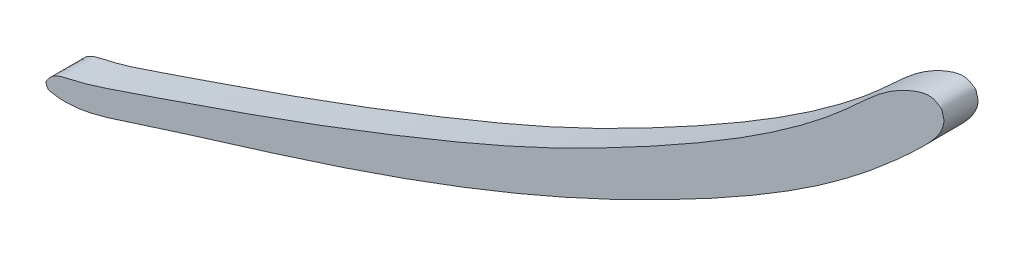
ISO-10303-21;
HEADER;
FILE_DESCRIPTION(('STEP AP214'),'2;1');
FILE_NAME('part.step','',(''),(''),'','','');
FILE_SCHEMA(('AUTOMOTIVE_DESIGN { 1 0 10303 214 1 1 1 1 }'));
ENDSEC;
DATA;
#1=APPLICATION_CONTEXT('core data for automotive mechanical design processes');
#2=APPLICATION_PROTOCOL_DEFINITION('international standard','automotive_design',2000,#1);
#3=PRODUCT_CONTEXT('',#1,'mechanical');
#4=PRODUCT('Part','Part','',(#3));
#5=PRODUCT_RELATED_PRODUCT_CATEGORY('part','',(#4));
#6=PRODUCT_DEFINITION_FORMATION('','',#4);
#7=PRODUCT_DEFINITION_CONTEXT('part definition',#1,'design');
#8=PRODUCT_DEFINITION('design','',#6,#7);
#9=PRODUCT_DEFINITION_SHAPE('','',#8);
#10=(LENGTH_UNIT() NAMED_UNIT(*) SI_UNIT(.MILLI.,.METRE.));
#11=(NAMED_UNIT(*) PLANE_ANGLE_UNIT() SI_UNIT($,.RADIAN.));
#12=(NAMED_UNIT(*) SI_UNIT($,.STERADIAN.) SOLID_ANGLE_UNIT());
#13=UNCERTAINTY_MEASURE_WITH_UNIT(LENGTH_MEASURE(1.E-05),#10,'distance_accuracy_value','');
#14=(GEOMETRIC_REPRESENTATION_CONTEXT(3) GLOBAL_UNCERTAINTY_ASSIGNED_CONTEXT((#13)) GLOBAL_UNIT_ASSIGNED_CONTEXT((#10,
#11,#12)) REPRESENTATION_CONTEXT('',''));
#15=CARTESIAN_POINT('',(0.,0.,0.));
#16=DIRECTION('',(0.,0.,1.));
#17=DIRECTION('',(1.,0.,0.));
#18=AXIS2_PLACEMENT_3D('',#15,#16,#17);
#19=CARTESIAN_POINT('',(101.622848183552,0.,156.));
#20=CARTESIAN_POINT('',(101.537605111122,0.134648646876426,156.));
#21=CARTESIAN_POINT('',(101.40906521183,0.228711270862638,156.));
#22=CARTESIAN_POINT('',(101.146230490369,0.401189460032345,156.));
#23=CARTESIAN_POINT('',(101.009679072405,0.479029705191223,156.));
#24=CARTESIAN_POINT('',(100.740406481971,0.640976127831622,156.));
#25=CARTESIAN_POINT('',(100.607190306053,0.724272524815575,156.));
#26=CARTESIAN_POINT('',(100.334541480456,0.880695734630485,156.));
#27=CARTESIAN_POINT('',(100.195528433057,0.954003215468977,156.));
#28=CARTESIAN_POINT('',(99.9127333388427,1.08591747331554,156.));
#29=CARTESIAN_POINT('',(99.7685304854786,1.14432559319761,156.));
#30=CARTESIAN_POINT('',(99.4697775136988,1.23329760125661,156.));
#31=CARTESIAN_POINT('',(99.3141843613839,1.26481227309826,156.));
#32=CARTESIAN_POINT('',(98.8446136631974,1.32384602962085,156.));
#33=CARTESIAN_POINT('',(98.5326371307815,1.31692921151142,156.));
#34=CARTESIAN_POINT('',(97.9097347146916,1.25768522519329,156.));
#35=CARTESIAN_POINT('',(97.598437716388,1.20388915218276,156.));
#36=CARTESIAN_POINT('',(96.9875195032316,1.07463401147855,156.));
#37=CARTESIAN_POINT('',(96.6860856460702,0.998022250957641,156.));
#38=CARTESIAN_POINT('',(95.7925009333327,0.736280158182597,156.));
#39=CARTESIAN_POINT('',(95.2101645048551,0.521929783003616,156.));
#40=CARTESIAN_POINT('',(94.0580346173148,0.0558854260309359,156.));
#41=CARTESIAN_POINT('',(93.4874807146803,-0.199259436129208,156.));
#42=CARTESIAN_POINT('',(92.3680018184991,-0.742928115782679,156.));
#43=CARTESIAN_POINT('',(91.8193061873208,-1.03060649749041,156.));
#44=CARTESIAN_POINT('',(90.2038498730924,-1.93758588627668,156.));
#45=CARTESIAN_POINT('',(89.1692390637865,-2.60301079690356,156.));
#46=CARTESIAN_POINT('',(86.1870088960859,-4.77374254115524,156.));
#47=CARTESIAN_POINT('',(84.3501377600649,-6.43822785878241,156.));
#48=CARTESIAN_POINT('',(81.6143903284867,-8.9617889282107,156.));
#49=CARTESIAN_POINT('',(80.7041747688018,-9.8053567333634,156.));
#50=CARTESIAN_POINT('',(78.8666120365893,-11.4685037446519,156.));
#51=CARTESIAN_POINT('',(77.940920732158,-12.2904015857083,156.));
#52=CARTESIAN_POINT('',(75.127066782742,-14.7045937384893,156.));
#53=CARTESIAN_POINT('',(73.2035040007574,-16.2473188882537,156.));
#54=CARTESIAN_POINT('',(69.2946878203231,-19.2463866927375,156.));
#55=CARTESIAN_POINT('',(67.3093961722193,-20.7026757882491,156.));
#56=CARTESIAN_POINT('',(63.2925154750126,-23.5504258864188,156.));
#57=CARTESIAN_POINT('',(61.2597009187462,-24.9401708685124,156.));
#58=CARTESIAN_POINT('',(57.1463974049492,-27.6529045905525,156.));
#59=CARTESIAN_POINT('',(55.0665857301135,-28.9768416978907,156.));
#60=CARTESIAN_POINT('',(50.8703128414365,-31.5733972712086,156.));
#61=CARTESIAN_POINT('',(48.7540849093805,-32.8463423907997,156.));
#62=CARTESIAN_POINT('',(44.4956253622801,-35.3558208846375,156.));
#63=CARTESIAN_POINT('',(42.3524760007452,-36.5923029583744,156.));
#64=CARTESIAN_POINT('',(35.8947096439914,-40.2519357172918,156.));
#65=CARTESIAN_POINT('',(31.5514698812376,-42.6247846489386,156.));
#66=CARTESIAN_POINT('',(22.8065012022564,-47.256254234176,156.));
#67=CARTESIAN_POINT('',(18.4054711465651,-49.5157657997033,156.));
#68=CARTESIAN_POINT('',(9.52730973040684,-53.8849009086727,156.));
#69=CARTESIAN_POINT('',(5.04726459129685,-55.990681542723,156.));
#70=CARTESIAN_POINT('',(-3.98105488418484,-60.0392844770572,156.));
#71=CARTESIAN_POINT('',(-8.52992677784784,-61.9843761443457,156.));
#72=CARTESIAN_POINT('',(-17.6705751286595,-65.7766553932417,156.));
#73=CARTESIAN_POINT('',(-22.2598831928666,-67.6269061923665,156.));
#74=CARTESIAN_POINT('',(-31.4594320489166,-71.268856377069,156.));
#75=CARTESIAN_POINT('',(-36.0712189810293,-73.0582327489743,156.));
#76=CARTESIAN_POINT('',(-45.323512493915,-76.5614388671446,156.));
#77=CARTESIAN_POINT('',(-49.9643916607804,-78.2742885310146,156.));
#78=CARTESIAN_POINT('',(-59.2741837056192,-81.6262455820493,156.));
#79=CARTESIAN_POINT('',(-63.9427607702543,-83.266739077693,156.));
#80=CARTESIAN_POINT('',(-73.2914199859347,-86.5138319703712,156.));
#81=CARTESIAN_POINT('',(-77.9707265949146,-88.1230230419267,156.));
#82=CARTESIAN_POINT('',(-84.9926790361386,-90.5280179084002,156.));
#83=CARTESIAN_POINT('',(-87.3341713780397,-91.3272462536489,156.));
#84=CARTESIAN_POINT('',(-90.8499336278073,-92.515660714985,156.));
#85=CARTESIAN_POINT('',(-92.0223963906068,-92.9101926852077,156.));
#86=CARTESIAN_POINT('',(-94.3683615376695,-93.6961758447894,156.));
#87=CARTESIAN_POINT('',(-95.541584804637,-94.088416817815,156.));
#88=CARTESIAN_POINT('',(-97.9035187474458,-94.8228645187706,156.));
#89=CARTESIAN_POINT('',(-99.0934412039141,-95.1629545986872,156.));
#90=CARTESIAN_POINT('',(-100.894748481726,-95.6133067554002,156.));
#91=CARTESIAN_POINT('',(-101.498346625394,-95.7513186500921,156.));
#92=CARTESIAN_POINT('',(-102.708687041151,-96.0153068317885,156.));
#93=CARTESIAN_POINT('',(-103.31441514225,-96.1451653279565,156.));
#94=CARTESIAN_POINT('',(-104.212878433991,-96.3787259745096,156.));
#95=CARTESIAN_POINT('',(-104.510763076726,-96.4627162121272,156.));
#96=CARTESIAN_POINT('',(-105.101258367697,-96.6508853438684,156.));
#97=CARTESIAN_POINT('',(-105.394304667261,-96.7549740719645,156.));
#98=CARTESIAN_POINT('',(-105.968674332705,-97.0015471239042,156.));
#99=CARTESIAN_POINT('',(-106.2450299185,-97.141857399498,156.));
#100=CARTESIAN_POINT('',(-106.63483017876,-97.391203671223,156.));
#101=CARTESIAN_POINT('',(-106.760649809079,-97.4807860385374,156.));
#102=CARTESIAN_POINT('',(-107.002196653033,-97.6758162138472,156.));
#103=CARTESIAN_POINT('',(-107.11821927252,-97.781764070746,156.));
#104=CARTESIAN_POINT('',(-107.341665645043,-98.0024707733634,156.));
#105=CARTESIAN_POINT('',(-107.448752775227,-98.1168287533949,156.));
#106=CARTESIAN_POINT('',(-107.653866954454,-98.3533708183518,156.));
#107=CARTESIAN_POINT('',(-107.752029186714,-98.4754381319126,156.));
#108=CARTESIAN_POINT('',(-107.948443568431,-98.7194950884939,156.));
#109=CARTESIAN_POINT('',(-108.046529737858,-98.8424717557614,156.));
#110=CARTESIAN_POINT('',(-108.219736761529,-99.1035885319167,156.));
#111=CARTESIAN_POINT('',(-108.295243522535,-99.2454925099389,156.));
#112=CARTESIAN_POINT('',(-108.326417424198,-99.5608693808048,156.));
#113=CARTESIAN_POINT('',(-108.286982028241,-99.7167071926553,156.));
#114=CARTESIAN_POINT('',(-108.180934748737,-100.008528863948,156.));
#115=CARTESIAN_POINT('',(-108.116627060448,-100.149817378666,156.));
#116=CARTESIAN_POINT('',(-107.969240985304,-100.424705306754,156.));
#117=CARTESIAN_POINT('',(-107.884353031452,-100.560001735898,156.));
#118=CARTESIAN_POINT('',(-107.708454945827,-100.713567110712,156.));
#119=CARTESIAN_POINT('',(-107.6423687698,-100.756482210758,156.));
#120=CARTESIAN_POINT('',(-107.499287791035,-100.819383468753,156.));
#121=CARTESIAN_POINT('',(-107.423775295691,-100.83882644562,156.));
#122=CARTESIAN_POINT('',(-107.192763293121,-100.881190867035,156.));
#123=CARTESIAN_POINT('',(-107.036343717432,-100.89028573105,156.));
#124=CARTESIAN_POINT('',(-106.724891452936,-100.919475045158,156.));
#125=CARTESIAN_POINT('',(-106.569677168083,-100.938105103227,156.));
#126=CARTESIAN_POINT('',(-106.104917012564,-101.000954470016,156.));
#127=CARTESIAN_POINT('',(-105.79590900887,-101.051346975483,156.));
#128=CARTESIAN_POINT('',(-105.177474909293,-101.13867029353,156.));
#129=CARTESIAN_POINT('',(-104.868272550158,-101.172224153504,156.));
#130=CARTESIAN_POINT('',(-104.249910677229,-101.209852443784,156.));
#131=CARTESIAN_POINT('',(-103.940747572721,-101.216397439035,156.));
#132=CARTESIAN_POINT('',(-103.013297273085,-101.209189198866,156.));
#133=CARTESIAN_POINT('',(-102.395047309086,-101.169819352351,156.));
#134=CARTESIAN_POINT('',(-101.158599700688,-101.055081533837,156.));
#135=CARTESIAN_POINT('',(-100.540072845651,-100.97626312471,156.));
#136=CARTESIAN_POINT('',(-98.7022709000994,-100.684378642864,156.));
#137=CARTESIAN_POINT('',(-97.4949931044292,-100.413199348934,156.));
#138=CARTESIAN_POINT('',(-95.0989601695005,-99.791690848018,156.));
#139=CARTESIAN_POINT('',(-93.9093758096638,-99.4448107398631,156.));
#140=CARTESIAN_POINT('',(-91.5376316445268,-98.7197038414733,156.));
#141=CARTESIAN_POINT('',(-90.3565117221597,-98.3421484894428,156.));
#142=CARTESIAN_POINT('',(-87.9963259120951,-97.5805534861939,156.));
#143=CARTESIAN_POINT('',(-86.8176614033913,-97.1953001447668,156.));
#144=CARTESIAN_POINT('',(-83.2801906977499,-96.0441614738982,156.));
#145=CARTESIAN_POINT('',(-80.9196594938039,-95.2834820062516,156.));
#146=CARTESIAN_POINT('',(-73.8266395788924,-93.0376043379808,156.));
#147=CARTESIAN_POINT('',(-69.0851213009976,-91.5812276802334,156.));
#148=CARTESIAN_POINT('',(-59.6058238538929,-88.656791950791,156.));
#149=CARTESIAN_POINT('',(-54.8684598903855,-87.1874838111644,156.));
#150=CARTESIAN_POINT('',(-45.4161206635591,-84.179388883826,156.));
#151=CARTESIAN_POINT('',(-40.7009848342989,-82.6411003789288,156.));
#152=CARTESIAN_POINT('',(-31.3011414080778,-79.4700957147384,156.));
#153=CARTESIAN_POINT('',(-26.616963298526,-77.836580839526,156.));
#154=CARTESIAN_POINT('',(-17.2910794161762,-74.4605584411791,156.));
#155=CARTESIAN_POINT('',(-12.6488861426408,-72.7171570481896,156.));
#156=CARTESIAN_POINT('',(-3.41215208926959,-69.1031421969494,156.));
#157=CARTESIAN_POINT('',(1.18362772926153,-67.2326884349845,156.));
#158=CARTESIAN_POINT('',(10.3122819969429,-63.3484139948588,156.));
#159=CARTESIAN_POINT('',(14.8465041269227,-61.3340906145856,156.));
#160=CARTESIAN_POINT('',(23.8499378698542,-57.1670208470758,156.));
#161=CARTESIAN_POINT('',(28.3210608912023,-55.0139838874307,156.));
#162=CARTESIAN_POINT('',(37.1927317100672,-50.5808075226333,156.));
#163=CARTESIAN_POINT('',(41.5906439635459,-48.3034897238829,156.));
#164=CARTESIAN_POINT('',(50.2998384800776,-43.6101260603546,156.));
#165=CARTESIAN_POINT('',(54.6117234791816,-41.1950454087355,156.));
#166=CARTESIAN_POINT('',(63.1133749815464,-36.1693252387439,156.));
#167=CARTESIAN_POINT('',(67.3020293191672,-33.5569047137297,156.));
#168=CARTESIAN_POINT('',(75.4892404681736,-28.0276441198274,156.));
#169=CARTESIAN_POINT('',(79.4857061501301,-25.1074553452538,156.));
#170=CARTESIAN_POINT('',(85.3070397202975,-20.4495479507672,156.));
#171=CARTESIAN_POINT('',(87.2198498864238,-18.8499278614635,156.));
#172=CARTESIAN_POINT('',(90.9863968728629,-15.5679540414709,156.));
#173=CARTESIAN_POINT('',(92.837396130523,-13.8904996515547,156.));
#174=CARTESIAN_POINT('',(95.5711312144641,-11.3282606373798,156.));
#175=CARTESIAN_POINT('',(96.4749097976919,-10.4663724495225,156.));
#176=CARTESIAN_POINT('',(97.8021920973372,-9.14385412054112,156.));
#177=CARTESIAN_POINT('',(98.2384486015141,-8.69715686225672,156.));
#178=CARTESIAN_POINT('',(99.0899125019313,-7.78419540124141,156.));
#179=CARTESIAN_POINT('',(99.5074246881025,-7.31780511689371,156.));
#180=CARTESIAN_POINT('',(100.29576181743,-6.35221827537252,156.));
#181=CARTESIAN_POINT('',(100.665140615824,-5.85448148493987,156.));
#182=CARTESIAN_POINT('',(101.320924110692,-4.80899078553011,156.));
#183=CARTESIAN_POINT('',(101.605480417977,-4.26012266020104,156.));
#184=CARTESIAN_POINT('',(101.928520038191,-3.37425252953464,156.));
#185=CARTESIAN_POINT('',(102.01936930923,-3.06804359398168,156.));
#186=CARTESIAN_POINT('',(102.104934215619,-2.60461790128647,156.));
#187=CARTESIAN_POINT('',(102.125129621129,-2.44880394300453,156.));
#188=CARTESIAN_POINT('',(102.143563059702,-2.13364562481497,156.));
#189=CARTESIAN_POINT('',(102.141895520953,-1.97255096243569,156.));
#190=CARTESIAN_POINT('',(102.090112628744,-1.50159141519154,156.));
#191=CARTESIAN_POINT('',(101.993138112838,-1.20159768405884,156.));
#192=CARTESIAN_POINT('',(101.854977011972,-0.749972914873829,156.));
#193=CARTESIAN_POINT('',(101.815523974778,-0.597876442481508,156.));
#194=CARTESIAN_POINT('',(101.759141791929,-0.368699416606629,156.));
#195=CARTESIAN_POINT('',(101.741009360747,-0.292099748490378,156.));
#196=CARTESIAN_POINT('',(101.694767256371,-0.142026848460829,156.));
#197=CARTESIAN_POINT('',(101.665469719768,-0.0673243234382012,156.));
#198=CARTESIAN_POINT('',(101.622848183552,0.,156.));
#199=B_SPLINE_CURVE_WITH_KNOTS('',3,(#19,#20,#21,#22,#23,#24,#25,#26,#27,#28,#29,#30,#31,#32,
#33,#34,#35,#36,#37,#38,#39,#40,#41,#42,#43,#44,#45,#46,#47,#48,#49,#50,#51,#52,#53,#54,#55,#56,
#57,#58,#59,#60,#61,#62,#63,#64,#65,#66,#67,#68,#69,#70,#71,#72,#73,#74,#75,#76,#77,#78,#79,#80,
#81,#82,#83,#84,#85,#86,#87,#88,#89,#90,#91,#92,#93,#94,#95,#96,#97,#98,#99,#100,#101,#102,#103,
#104,#105,#106,#107,#108,#109,#110,#111,#112,#113,#114,#115,#116,#117,#118,#119,#120,#121,#122,
#123,#124,#125,#126,#127,#128,#129,#130,#131,#132,#133,#134,#135,#136,#137,#138,#139,#140,#141,
#142,#143,#144,#145,#146,#147,#148,#149,#150,#151,#152,#153,#154,#155,#156,#157,#158,#159,#160,
#161,#162,#163,#164,#165,#166,#167,#168,#169,#170,#171,#172,#173,#174,#175,#176,#177,#178,#179,
#180,#181,#182,#183,#184,#185,#186,#187,#188,#189,#190,#191,#192,#193,#194,#195,#196,#197,#198),
.UNSPECIFIED.,.T.,.F.,(4,2,2,2,2,2,2,2,2,2,2,2,2,2,2,2,2,2,2,2,2,2,2,2,2,2,2,2,2,2,2,2,2,2,2,2,
2,2,2,2,2,2,2,2,2,2,2,2,2,2,2,2,2,2,2,2,2,2,2,2,2,2,2,2,2,2,2,2,2,2,2,2,2,2,2,2,2,2,2,2,2,2,2,2,
2,2,2,2,2,4),(0.,0.000976562500000036,0.00195312500000007,0.00292968750000011,
0.00390625000000014,0.00488281250000018,0.00585937500000021,0.00781250000000028,
0.00976562500000036,0.0117187500000004,0.0156250000000007,0.0195312500000009,0.0234375000000011,
0.0312500000000016,0.0468750000000025,0.0546875000000029,0.0625000000000033,0.0781250000000041,
0.093750000000005,0.109375000000006,0.125000000000006,0.140625000000007,0.156250000000008,
0.187500000000009,0.218750000000011,0.250000000000012,0.281250000000014,0.312500000000015,
0.343750000000017,0.375000000000018,0.40625000000002,0.437500000000021,0.453125000000022,
0.460937500000022,0.468750000000023,0.476562500000023,0.480468750000023,0.484375000000023,
0.486328125000024,0.488281250000024,0.490234375000024,0.491210937500024,0.492187500000024,
0.493164062500024,0.494140625000024,0.495117187500024,0.496093750000024,0.497070312500024,
0.498046875000024,0.499023437500024,0.499511718750024,0.500000000000024,0.500976562500024,
0.501953125000024,0.503906250000024,0.505859375000024,0.507812500000024,0.511718750000024,
0.515625000000024,0.523437500000023,0.531250000000023,0.539062500000022,0.546875000000022,
0.562500000000021,0.59375000000002,0.625000000000018,0.656250000000017,0.687500000000015,
0.718750000000014,0.750000000000012,0.78125000000001,0.812500000000009,0.843750000000008,
0.875000000000006,0.906250000000005,0.937500000000003,0.953125000000003,0.968750000000002,
0.976562500000001,0.980468750000001,0.984375000000001,0.988281250000001,0.992187500000001,
0.994140625,0.9951171875,0.99609375,0.998046875,0.9990234375,0.99951171875,1.),.UNSPECIFIED.);
#200=DIRECTION('',(0.,0.,-1.));
#201=VECTOR('',#200,1.);
#202=SURFACE_OF_LINEAR_EXTRUSION('',#199,#201);
#203=CARTESIAN_POINT('',(101.622848183552,0.,156.));
#204=CARTESIAN_POINT('',(101.665469719768,-0.0673243234382012,156.));
#205=CARTESIAN_POINT('',(101.694767256371,-0.142026848460829,156.));
#206=CARTESIAN_POINT('',(101.741009360747,-0.292099748490378,156.));
#207=CARTESIAN_POINT('',(101.759141791929,-0.368699416606629,156.));
#208=CARTESIAN_POINT('',(101.815523974778,-0.597876442481508,156.));
#209=CARTESIAN_POINT('',(101.854977011972,-0.749972914873829,156.));
#210=CARTESIAN_POINT('',(101.993138112838,-1.20159768405884,156.));
#211=CARTESIAN_POINT('',(102.090112628744,-1.50159141519154,156.));
#212=CARTESIAN_POINT('',(102.141895520953,-1.97255096243569,156.));
#213=CARTESIAN_POINT('',(102.143563059702,-2.13364562481497,156.));
#214=CARTESIAN_POINT('',(102.125129621129,-2.44880394300453,156.));
#215=CARTESIAN_POINT('',(102.104934215619,-2.60461790128647,156.));
#216=CARTESIAN_POINT('',(102.01936930923,-3.06804359398168,156.));
#217=CARTESIAN_POINT('',(101.928520038191,-3.37425252953464,156.));
#218=CARTESIAN_POINT('',(101.605480417977,-4.26012266020104,156.));
#219=CARTESIAN_POINT('',(101.320924110692,-4.80899078553011,156.));
#220=CARTESIAN_POINT('',(100.665140615824,-5.85448148493987,156.));
#221=CARTESIAN_POINT('',(100.29576181743,-6.35221827537252,156.));
#222=CARTESIAN_POINT('',(99.5074246881025,-7.31780511689371,156.));
#223=CARTESIAN_POINT('',(99.0899125019313,-7.78419540124141,156.));
#224=CARTESIAN_POINT('',(98.2384486015141,-8.69715686225672,156.));
#225=CARTESIAN_POINT('',(97.8021920973372,-9.14385412054112,156.));
#226=CARTESIAN_POINT('',(96.4749097976919,-10.4663724495225,156.));
#227=CARTESIAN_POINT('',(95.5711312144641,-11.3282606373798,156.));
#228=CARTESIAN_POINT('',(92.837396130523,-13.8904996515547,156.));
#229=CARTESIAN_POINT('',(90.9863968728629,-15.5679540414709,156.));
#230=CARTESIAN_POINT('',(87.2198498864238,-18.8499278614635,156.));
#231=CARTESIAN_POINT('',(85.3070397202975,-20.4495479507672,156.));
#232=CARTESIAN_POINT('',(79.4857061501301,-25.1074553452538,156.));
#233=CARTESIAN_POINT('',(75.4892404681736,-28.0276441198274,156.));
#234=CARTESIAN_POINT('',(67.3020293191672,-33.5569047137297,156.));
#235=CARTESIAN_POINT('',(63.1133749815464,-36.1693252387439,156.));
#236=CARTESIAN_POINT('',(54.6117234791816,-41.1950454087355,156.));
#237=CARTESIAN_POINT('',(50.2998384800776,-43.6101260603546,156.));
#238=CARTESIAN_POINT('',(41.5906439635459,-48.3034897238829,156.));
#239=CARTESIAN_POINT('',(37.1927317100672,-50.5808075226333,156.));
#240=CARTESIAN_POINT('',(28.3210608912023,-55.0139838874307,156.));
#241=CARTESIAN_POINT('',(23.8499378698542,-57.1670208470758,156.));
#242=CARTESIAN_POINT('',(14.8465041269227,-61.3340906145856,156.));
#243=CARTESIAN_POINT('',(10.3122819969429,-63.3484139948588,156.));
#244=CARTESIAN_POINT('',(1.18362772926153,-67.2326884349845,156.));
#245=CARTESIAN_POINT('',(-3.41215208926959,-69.1031421969494,156.));
#246=CARTESIAN_POINT('',(-12.6488861426408,-72.7171570481896,156.));
#247=CARTESIAN_POINT('',(-17.2910794161762,-74.4605584411791,156.));
#248=CARTESIAN_POINT('',(-26.616963298526,-77.836580839526,156.));
#249=CARTESIAN_POINT('',(-31.3011414080778,-79.4700957147384,156.));
#250=CARTESIAN_POINT('',(-40.7009848342989,-82.6411003789288,156.));
#251=CARTESIAN_POINT('',(-45.4161206635591,-84.179388883826,156.));
#252=CARTESIAN_POINT('',(-54.8684598903855,-87.1874838111644,156.));
#253=CARTESIAN_POINT('',(-59.6058238538929,-88.656791950791,156.));
#254=CARTESIAN_POINT('',(-69.0851213009976,-91.5812276802334,156.));
#255=CARTESIAN_POINT('',(-73.8266395788924,-93.0376043379808,156.));
#256=CARTESIAN_POINT('',(-80.9196594938039,-95.2834820062516,156.));
#257=CARTESIAN_POINT('',(-83.2801906977499,-96.0441614738982,156.));
#258=CARTESIAN_POINT('',(-86.8176614033913,-97.1953001447668,156.));
#259=CARTESIAN_POINT('',(-87.9963259120951,-97.5805534861939,156.));
#260=CARTESIAN_POINT('',(-90.3565117221597,-98.3421484894428,156.));
#261=CARTESIAN_POINT('',(-91.5376316445268,-98.7197038414733,156.));
#262=CARTESIAN_POINT('',(-93.9093758096638,-99.4448107398631,156.));
#263=CARTESIAN_POINT('',(-95.0989601695005,-99.791690848018,156.));
#264=CARTESIAN_POINT('',(-97.4949931044292,-100.413199348934,156.));
#265=CARTESIAN_POINT('',(-98.7022709000994,-100.684378642864,156.));
#266=CARTESIAN_POINT('',(-100.540072845651,-100.97626312471,156.));
#267=CARTESIAN_POINT('',(-101.158599700688,-101.055081533837,156.));
#268=CARTESIAN_POINT('',(-102.395047309086,-101.169819352351,156.));
#269=CARTESIAN_POINT('',(-103.013297273085,-101.209189198866,156.));
#270=CARTESIAN_POINT('',(-103.940747572721,-101.216397439035,156.));
#271=CARTESIAN_POINT('',(-104.249910677229,-101.209852443784,156.));
#272=CARTESIAN_POINT('',(-104.868272550158,-101.172224153504,156.));
#273=CARTESIAN_POINT('',(-105.177474909293,-101.13867029353,156.));
#274=CARTESIAN_POINT('',(-105.79590900887,-101.051346975483,156.));
#275=CARTESIAN_POINT('',(-106.104917012564,-101.000954470016,156.));
#276=CARTESIAN_POINT('',(-106.569677168083,-100.938105103227,156.));
#277=CARTESIAN_POINT('',(-106.724891452936,-100.919475045158,156.));
#278=CARTESIAN_POINT('',(-107.036343717432,-100.89028573105,156.));
#279=CARTESIAN_POINT('',(-107.192763293121,-100.881190867035,156.));
#280=CARTESIAN_POINT('',(-107.423775295691,-100.83882644562,156.));
#281=CARTESIAN_POINT('',(-107.499287791035,-100.819383468753,156.));
#282=CARTESIAN_POINT('',(-107.6423687698,-100.756482210758,156.));
#283=CARTESIAN_POINT('',(-107.708454945827,-100.713567110712,156.));
#284=CARTESIAN_POINT('',(-107.884353031452,-100.560001735898,156.));
#285=CARTESIAN_POINT('',(-107.969240985304,-100.424705306754,156.));
#286=CARTESIAN_POINT('',(-108.116627060448,-100.149817378666,156.));
#287=CARTESIAN_POINT('',(-108.180934748737,-100.008528863948,156.));
#288=CARTESIAN_POINT('',(-108.286982028241,-99.7167071926553,156.));
#289=CARTESIAN_POINT('',(-108.326417424198,-99.5608693808048,156.));
#290=CARTESIAN_POINT('',(-108.295243522535,-99.2454925099389,156.));
#291=CARTESIAN_POINT('',(-108.219736761529,-99.1035885319167,156.));
#292=CARTESIAN_POINT('',(-108.046529737858,-98.8424717557614,156.));
#293=CARTESIAN_POINT('',(-107.948443568431,-98.7194950884939,156.));
#294=CARTESIAN_POINT('',(-107.752029186714,-98.4754381319126,156.));
#295=CARTESIAN_POINT('',(-107.653866954454,-98.3533708183518,156.));
#296=CARTESIAN_POINT('',(-107.448752775227,-98.1168287533949,156.));
#297=CARTESIAN_POINT('',(-107.341665645043,-98.0024707733634,156.));
#298=CARTESIAN_POINT('',(-107.11821927252,-97.781764070746,156.));
#299=CARTESIAN_POINT('',(-107.002196653033,-97.6758162138472,156.));
#300=CARTESIAN_POINT('',(-106.760649809079,-97.4807860385374,156.));
#301=CARTESIAN_POINT('',(-106.63483017876,-97.391203671223,156.));
#302=CARTESIAN_POINT('',(-106.2450299185,-97.141857399498,156.));
#303=CARTESIAN_POINT('',(-105.968674332705,-97.0015471239042,156.));
#304=CARTESIAN_POINT('',(-105.394304667261,-96.7549740719645,156.));
#305=CARTESIAN_POINT('',(-105.101258367697,-96.6508853438684,156.));
#306=CARTESIAN_POINT('',(-104.510763076726,-96.4627162121272,156.));
#307=CARTESIAN_POINT('',(-104.212878433991,-96.3787259745096,156.));
#308=CARTESIAN_POINT('',(-103.31441514225,-96.1451653279565,156.));
#309=CARTESIAN_POINT('',(-102.708687041151,-96.0153068317885,156.));
#310=CARTESIAN_POINT('',(-101.498346625394,-95.7513186500921,156.));
#311=CARTESIAN_POINT('',(-100.894748481726,-95.6133067554002,156.));
#312=CARTESIAN_POINT('',(-99.0934412039141,-95.1629545986872,156.));
#313=CARTESIAN_POINT('',(-97.9035187474458,-94.8228645187706,156.));
#314=CARTESIAN_POINT('',(-95.541584804637,-94.088416817815,156.));
#315=CARTESIAN_POINT('',(-94.3683615376695,-93.6961758447894,156.));
#316=CARTESIAN_POINT('',(-92.0223963906068,-92.9101926852077,156.));
#317=CARTESIAN_POINT('',(-90.8499336278073,-92.515660714985,156.));
#318=CARTESIAN_POINT('',(-87.3341713780397,-91.3272462536489,156.));
#319=CARTESIAN_POINT('',(-84.9926790361386,-90.5280179084002,156.));
#320=CARTESIAN_POINT('',(-77.9707265949146,-88.1230230419267,156.));
#321=CARTESIAN_POINT('',(-73.2914199859347,-86.5138319703712,156.));
#322=CARTESIAN_POINT('',(-63.9427607702543,-83.266739077693,156.));
#323=CARTESIAN_POINT('',(-59.2741837056192,-81.6262455820493,156.));
#324=CARTESIAN_POINT('',(-49.9643916607804,-78.2742885310146,156.));
#325=CARTESIAN_POINT('',(-45.323512493915,-76.5614388671446,156.));
#326=CARTESIAN_POINT('',(-36.0712189810293,-73.0582327489743,156.));
#327=CARTESIAN_POINT('',(-31.4594320489166,-71.268856377069,156.));
#328=CARTESIAN_POINT('',(-22.2598831928666,-67.6269061923665,156.));
#329=CARTESIAN_POINT('',(-17.6705751286595,-65.7766553932417,156.));
#330=CARTESIAN_POINT('',(-8.52992677784784,-61.9843761443457,156.));
#331=CARTESIAN_POINT('',(-3.98105488418484,-60.0392844770572,156.));
#332=CARTESIAN_POINT('',(5.04726459129685,-55.990681542723,156.));
#333=CARTESIAN_POINT('',(9.52730973040684,-53.8849009086727,156.));
#334=CARTESIAN_POINT('',(18.4054711465651,-49.5157657997033,156.));
#335=CARTESIAN_POINT('',(22.8065012022564,-47.256254234176,156.));
#336=CARTESIAN_POINT('',(31.5514698812376,-42.6247846489386,156.));
#337=CARTESIAN_POINT('',(35.8947096439914,-40.2519357172918,156.));
#338=CARTESIAN_POINT('',(42.3524760007452,-36.5923029583744,156.));
#339=CARTESIAN_POINT('',(44.4956253622801,-35.3558208846375,156.));
#340=CARTESIAN_POINT('',(48.7540849093805,-32.8463423907997,156.));
#341=CARTESIAN_POINT('',(50.8703128414365,-31.5733972712086,156.));
#342=CARTESIAN_POINT('',(55.0665857301135,-28.9768416978907,156.));
#343=CARTESIAN_POINT('',(57.1463974049492,-27.6529045905525,156.));
#344=CARTESIAN_POINT('',(61.2597009187462,-24.9401708685124,156.));
#345=CARTESIAN_POINT('',(63.2925154750126,-23.5504258864188,156.));
#346=CARTESIAN_POINT('',(67.3093961722193,-20.7026757882491,156.));
#347=CARTESIAN_POINT('',(69.2946878203231,-19.2463866927375,156.));
#348=CARTESIAN_POINT('',(73.2035040007574,-16.2473188882537,156.));
#349=CARTESIAN_POINT('',(75.127066782742,-14.7045937384893,156.));
#350=CARTESIAN_POINT('',(77.940920732158,-12.2904015857083,156.));
#351=CARTESIAN_POINT('',(78.8666120365893,-11.4685037446519,156.));
#352=CARTESIAN_POINT('',(80.7041747688018,-9.8053567333634,156.));
#353=CARTESIAN_POINT('',(81.6143903284867,-8.9617889282107,156.));
#354=CARTESIAN_POINT('',(84.3501377600649,-6.43822785878241,156.));
#355=CARTESIAN_POINT('',(86.1870088960859,-4.77374254115524,156.));
#356=CARTESIAN_POINT('',(89.1692390637865,-2.60301079690356,156.));
#357=CARTESIAN_POINT('',(90.2038498730924,-1.93758588627668,156.));
#358=CARTESIAN_POINT('',(91.8193061873208,-1.03060649749041,156.));
#359=CARTESIAN_POINT('',(92.3680018184991,-0.742928115782679,156.));
#360=CARTESIAN_POINT('',(93.4874807146803,-0.199259436129208,156.));
#361=CARTESIAN_POINT('',(94.0580346173148,0.0558854260309359,156.));
#362=CARTESIAN_POINT('',(95.2101645048551,0.521929783003616,156.));
#363=CARTESIAN_POINT('',(95.7925009333327,0.736280158182597,156.));
#364=CARTESIAN_POINT('',(96.6860856460702,0.998022250957641,156.));
#365=CARTESIAN_POINT('',(96.9875195032316,1.07463401147855,156.));
#366=CARTESIAN_POINT('',(97.598437716388,1.20388915218276,156.));
#367=CARTESIAN_POINT('',(97.9097347146916,1.25768522519329,156.));
#368=CARTESIAN_POINT('',(98.5326371307815,1.31692921151142,156.));
#369=CARTESIAN_POINT('',(98.8446136631974,1.32384602962085,156.));
#370=CARTESIAN_POINT('',(99.3141843613839,1.26481227309826,156.));
#371=CARTESIAN_POINT('',(99.4697775136988,1.23329760125661,156.));
#372=CARTESIAN_POINT('',(99.7685304854786,1.14432559319761,156.));
#373=CARTESIAN_POINT('',(99.9127333388427,1.08591747331554,156.));
#374=CARTESIAN_POINT('',(100.195528433057,0.954003215468977,156.));
#375=CARTESIAN_POINT('',(100.334541480456,0.880695734630485,156.));
#376=CARTESIAN_POINT('',(100.607190306053,0.724272524815575,156.));
#377=CARTESIAN_POINT('',(100.740406481971,0.640976127831622,156.));
#378=CARTESIAN_POINT('',(101.009679072405,0.479029705191223,156.));
#379=CARTESIAN_POINT('',(101.146230490369,0.401189460032345,156.));
#380=CARTESIAN_POINT('',(101.40906521183,0.228711270862638,156.));
#381=CARTESIAN_POINT('',(101.537605111122,0.134648646876426,156.));
#382=CARTESIAN_POINT('',(101.622848183552,0.,156.));
#383=B_SPLINE_CURVE_WITH_KNOTS('',3,(#203,#204,#205,#206,#207,#208,#209,#210,#211,#212,#213,
#214,#215,#216,#217,#218,#219,#220,#221,#222,#223,#224,#225,#226,#227,#228,#229,#230,#231,#232,
#233,#234,#235,#236,#237,#238,#239,#240,#241,#242,#243,#244,#245,#246,#247,#248,#249,#250,#251,
#252,#253,#254,#255,#256,#257,#258,#259,#260,#261,#262,#263,#264,#265,#266,#267,#268,#269,#270,
#271,#272,#273,#274,#275,#276,#277,#278,#279,#280,#281,#282,#283,#284,#285,#286,#287,#288,#289,
#290,#291,#292,#293,#294,#295,#296,#297,#298,#299,#300,#301,#302,#303,#304,#305,#306,#307,#308,
#309,#310,#311,#312,#313,#314,#315,#316,#317,#318,#319,#320,#321,#322,#323,#324,#325,#326,#327,
#328,#329,#330,#331,#332,#333,#334,#335,#336,#337,#338,#339,#340,#341,#342,#343,#344,#345,#346,
#347,#348,#349,#350,#351,#352,#353,#354,#355,#356,#357,#358,#359,#360,#361,#362,#363,#364,#365,
#366,#367,#368,#369,#370,#371,#372,#373,#374,#375,#376,#377,#378,#379,#380,#381,#382),
.UNSPECIFIED.,.T.,.F.,(4,2,2,2,2,2,2,2,2,2,2,2,2,2,2,2,2,2,2,2,2,2,2,2,2,2,2,2,2,2,2,2,2,2,2,2,
2,2,2,2,2,2,2,2,2,2,2,2,2,2,2,2,2,2,2,2,2,2,2,2,2,2,2,2,2,2,2,2,2,2,2,2,2,2,2,2,2,2,2,2,2,2,2,2,
2,2,2,2,2,4),(0.,0.000488281249999889,0.000976562499999889,0.00195312499999989,
0.00390624999999967,0.00488281249999967,0.00585937499999956,0.00781249999999944,
0.0117187499999992,0.015624999999999,0.0195312499999988,0.0234374999999987,0.0312499999999982,
0.0468749999999974,0.0624999999999968,0.0937499999999953,0.124999999999994,0.156249999999992,
0.187499999999991,0.21874999999999,0.249999999999988,0.281249999999986,0.312499999999985,
0.343749999999983,0.374999999999982,0.40624999999998,0.437499999999979,0.453124999999978,
0.460937499999978,0.468749999999977,0.476562499999977,0.484374999999976,0.488281249999976,
0.492187499999976,0.494140624999976,0.496093749999976,0.498046874999976,0.499023437499976,
0.499999999999976,0.500488281249976,0.500976562499976,0.501953124999976,0.502929687499976,
0.503906249999976,0.504882812499976,0.505859374999976,0.506835937499976,0.507812499999976,
0.508789062499976,0.509765624999976,0.511718749999976,0.513671874999976,0.515624999999977,
0.519531249999977,0.523437499999977,0.531249999999977,0.539062499999978,0.546874999999978,
0.562499999999979,0.59374999999998,0.624999999999982,0.656249999999983,0.687499999999985,
0.718749999999986,0.749999999999988,0.781249999999989,0.812499999999991,0.843749999999992,
0.859374999999993,0.874999999999994,0.890624999999994,0.906249999999995,0.921874999999996,
0.937499999999997,0.945312499999997,0.953124999999998,0.968749999999998,0.976562499999999,
0.980468749999999,0.984374999999999,0.98828125,0.990234375,0.9921875,0.994140625,0.9951171875,
0.99609375,0.9970703125,0.998046875,0.9990234375,1.),.UNSPECIFIED.);
#384=CARTESIAN_POINT('',(101.622848183552,0.,156.));
#385=VERTEX_POINT('',#384);
#386=EDGE_CURVE('E10',#385,#385,#383,.F.);
#387=ORIENTED_EDGE('',*,*,#386,.F.);
#388=EDGE_LOOP('',(#387));
#389=FACE_BOUND('',#388,.T.);
#390=CARTESIAN_POINT('',(101.622848183552,0.,148.));
#391=CARTESIAN_POINT('',(101.537605111122,0.134648646876426,148.));
#392=CARTESIAN_POINT('',(101.40906521183,0.228711270862638,148.));
#393=CARTESIAN_POINT('',(101.146230490369,0.401189460032345,148.));
#394=CARTESIAN_POINT('',(101.009679072405,0.479029705191223,148.));
#395=CARTESIAN_POINT('',(100.740406481971,0.640976127831622,148.));
#396=CARTESIAN_POINT('',(100.607190306053,0.724272524815575,148.));
#397=CARTESIAN_POINT('',(100.334541480456,0.880695734630485,148.));
#398=CARTESIAN_POINT('',(100.195528433057,0.954003215468977,148.));
#399=CARTESIAN_POINT('',(99.9127333388427,1.08591747331554,148.));
#400=CARTESIAN_POINT('',(99.7685304854786,1.14432559319761,148.));
#401=CARTESIAN_POINT('',(99.4697775136988,1.23329760125661,148.));
#402=CARTESIAN_POINT('',(99.3141843613839,1.26481227309826,148.));
#403=CARTESIAN_POINT('',(98.8446136631974,1.32384602962085,148.));
#404=CARTESIAN_POINT('',(98.5326371307815,1.31692921151142,148.));
#405=CARTESIAN_POINT('',(97.9097347146916,1.25768522519329,148.));
#406=CARTESIAN_POINT('',(97.598437716388,1.20388915218276,148.));
#407=CARTESIAN_POINT('',(96.9875195032316,1.07463401147855,148.));
#408=CARTESIAN_POINT('',(96.6860856460702,0.998022250957641,148.));
#409=CARTESIAN_POINT('',(95.7925009333327,0.736280158182597,148.));
#410=CARTESIAN_POINT('',(95.2101645048551,0.521929783003616,148.));
#411=CARTESIAN_POINT('',(94.0580346173148,0.0558854260309359,148.));
#412=CARTESIAN_POINT('',(93.4874807146803,-0.199259436129208,148.));
#413=CARTESIAN_POINT('',(92.3680018184991,-0.742928115782679,148.));
#414=CARTESIAN_POINT('',(91.8193061873208,-1.03060649749041,148.));
#415=CARTESIAN_POINT('',(90.2038498730924,-1.93758588627668,148.));
#416=CARTESIAN_POINT('',(89.1692390637865,-2.60301079690356,148.));
#417=CARTESIAN_POINT('',(86.1870088960859,-4.77374254115524,148.));
#418=CARTESIAN_POINT('',(84.3501377600649,-6.43822785878241,148.));
#419=CARTESIAN_POINT('',(81.6143903284867,-8.9617889282107,148.));
#420=CARTESIAN_POINT('',(80.7041747688018,-9.8053567333634,148.));
#421=CARTESIAN_POINT('',(78.8666120365893,-11.4685037446519,148.));
#422=CARTESIAN_POINT('',(77.940920732158,-12.2904015857083,148.));
#423=CARTESIAN_POINT('',(75.127066782742,-14.7045937384893,148.));
#424=CARTESIAN_POINT('',(73.2035040007574,-16.2473188882537,148.));
#425=CARTESIAN_POINT('',(69.2946878203231,-19.2463866927375,148.));
#426=CARTESIAN_POINT('',(67.3093961722193,-20.7026757882491,148.));
#427=CARTESIAN_POINT('',(63.2925154750126,-23.5504258864188,148.));
#428=CARTESIAN_POINT('',(61.2597009187462,-24.9401708685124,148.));
#429=CARTESIAN_POINT('',(57.1463974049492,-27.6529045905525,148.));
#430=CARTESIAN_POINT('',(55.0665857301135,-28.9768416978907,148.));
#431=CARTESIAN_POINT('',(50.8703128414365,-31.5733972712086,148.));
#432=CARTESIAN_POINT('',(48.7540849093805,-32.8463423907997,148.));
#433=CARTESIAN_POINT('',(44.4956253622801,-35.3558208846375,148.));
#434=CARTESIAN_POINT('',(42.3524760007452,-36.5923029583744,148.));
#435=CARTESIAN_POINT('',(35.8947096439914,-40.2519357172918,148.));
#436=CARTESIAN_POINT('',(31.5514698812376,-42.6247846489386,148.));
#437=CARTESIAN_POINT('',(22.8065012022564,-47.256254234176,148.));
#438=CARTESIAN_POINT('',(18.4054711465651,-49.5157657997033,148.));
#439=CARTESIAN_POINT('',(9.52730973040684,-53.8849009086727,148.));
#440=CARTESIAN_POINT('',(5.04726459129685,-55.990681542723,148.));
#441=CARTESIAN_POINT('',(-3.98105488418484,-60.0392844770572,148.));
#442=CARTESIAN_POINT('',(-8.52992677784784,-61.9843761443457,148.));
#443=CARTESIAN_POINT('',(-17.6705751286595,-65.7766553932417,148.));
#444=CARTESIAN_POINT('',(-22.2598831928666,-67.6269061923665,148.));
#445=CARTESIAN_POINT('',(-31.4594320489166,-71.268856377069,148.));
#446=CARTESIAN_POINT('',(-36.0712189810293,-73.0582327489743,148.));
#447=CARTESIAN_POINT('',(-45.323512493915,-76.5614388671446,148.));
#448=CARTESIAN_POINT('',(-49.9643916607804,-78.2742885310146,148.));
#449=CARTESIAN_POINT('',(-59.2741837056192,-81.6262455820493,148.));
#450=CARTESIAN_POINT('',(-63.9427607702543,-83.266739077693,148.));
#451=CARTESIAN_POINT('',(-73.2914199859347,-86.5138319703712,148.));
#452=CARTESIAN_POINT('',(-77.9707265949146,-88.1230230419267,148.));
#453=CARTESIAN_POINT('',(-84.9926790361386,-90.5280179084002,148.));
#454=CARTESIAN_POINT('',(-87.3341713780397,-91.3272462536489,148.));
#455=CARTESIAN_POINT('',(-90.8499336278073,-92.515660714985,148.));
#456=CARTESIAN_POINT('',(-92.0223963906068,-92.9101926852077,148.));
#457=CARTESIAN_POINT('',(-94.3683615376695,-93.6961758447894,148.));
#458=CARTESIAN_POINT('',(-95.541584804637,-94.088416817815,148.));
#459=CARTESIAN_POINT('',(-97.9035187474458,-94.8228645187706,148.));
#460=CARTESIAN_POINT('',(-99.0934412039141,-95.1629545986872,148.));
#461=CARTESIAN_POINT('',(-100.894748481726,-95.6133067554002,148.));
#462=CARTESIAN_POINT('',(-101.498346625394,-95.7513186500921,148.));
#463=CARTESIAN_POINT('',(-102.708687041151,-96.0153068317885,148.));
#464=CARTESIAN_POINT('',(-103.31441514225,-96.1451653279565,148.));
#465=CARTESIAN_POINT('',(-104.212878433991,-96.3787259745096,148.));
#466=CARTESIAN_POINT('',(-104.510763076726,-96.4627162121272,148.));
#467=CARTESIAN_POINT('',(-105.101258367697,-96.6508853438684,148.));
#468=CARTESIAN_POINT('',(-105.394304667261,-96.7549740719645,148.));
#469=CARTESIAN_POINT('',(-105.968674332705,-97.0015471239042,148.));
#470=CARTESIAN_POINT('',(-106.2450299185,-97.141857399498,148.));
#471=CARTESIAN_POINT('',(-106.63483017876,-97.391203671223,148.));
#472=CARTESIAN_POINT('',(-106.760649809079,-97.4807860385374,148.));
#473=CARTESIAN_POINT('',(-107.002196653033,-97.6758162138472,148.));
#474=CARTESIAN_POINT('',(-107.11821927252,-97.781764070746,148.));
#475=CARTESIAN_POINT('',(-107.341665645043,-98.0024707733634,148.));
#476=CARTESIAN_POINT('',(-107.448752775227,-98.1168287533949,148.));
#477=CARTESIAN_POINT('',(-107.653866954454,-98.3533708183518,148.));
#478=CARTESIAN_POINT('',(-107.752029186714,-98.4754381319126,148.));
#479=CARTESIAN_POINT('',(-107.948443568431,-98.7194950884939,148.));
#480=CARTESIAN_POINT('',(-108.046529737858,-98.8424717557614,148.));
#481=CARTESIAN_POINT('',(-108.219736761529,-99.1035885319167,148.));
#482=CARTESIAN_POINT('',(-108.295243522535,-99.2454925099389,148.));
#483=CARTESIAN_POINT('',(-108.326417424198,-99.5608693808048,148.));
#484=CARTESIAN_POINT('',(-108.286982028241,-99.7167071926553,148.));
#485=CARTESIAN_POINT('',(-108.180934748737,-100.008528863948,148.));
#486=CARTESIAN_POINT('',(-108.116627060448,-100.149817378666,148.));
#487=CARTESIAN_POINT('',(-107.969240985304,-100.424705306754,148.));
#488=CARTESIAN_POINT('',(-107.884353031452,-100.560001735898,148.));
#489=CARTESIAN_POINT('',(-107.708454945827,-100.713567110712,148.));
#490=CARTESIAN_POINT('',(-107.6423687698,-100.756482210758,148.));
#491=CARTESIAN_POINT('',(-107.499287791035,-100.819383468753,148.));
#492=CARTESIAN_POINT('',(-107.423775295691,-100.83882644562,148.));
#493=CARTESIAN_POINT('',(-107.192763293121,-100.881190867035,148.));
#494=CARTESIAN_POINT('',(-107.036343717432,-100.89028573105,148.));
#495=CARTESIAN_POINT('',(-106.724891452936,-100.919475045158,148.));
#496=CARTESIAN_POINT('',(-106.569677168083,-100.938105103227,148.));
#497=CARTESIAN_POINT('',(-106.104917012564,-101.000954470016,148.));
#498=CARTESIAN_POINT('',(-105.79590900887,-101.051346975483,148.));
#499=CARTESIAN_POINT('',(-105.177474909293,-101.13867029353,148.));
#500=CARTESIAN_POINT('',(-104.868272550158,-101.172224153504,148.));
#501=CARTESIAN_POINT('',(-104.249910677229,-101.209852443784,148.));
#502=CARTESIAN_POINT('',(-103.940747572721,-101.216397439035,148.));
#503=CARTESIAN_POINT('',(-103.013297273085,-101.209189198866,148.));
#504=CARTESIAN_POINT('',(-102.395047309086,-101.169819352351,148.));
#505=CARTESIAN_POINT('',(-101.158599700688,-101.055081533837,148.));
#506=CARTESIAN_POINT('',(-100.540072845651,-100.97626312471,148.));
#507=CARTESIAN_POINT('',(-98.7022709000994,-100.684378642864,148.));
#508=CARTESIAN_POINT('',(-97.4949931044292,-100.413199348934,148.));
#509=CARTESIAN_POINT('',(-95.0989601695005,-99.791690848018,148.));
#510=CARTESIAN_POINT('',(-93.9093758096638,-99.4448107398631,148.));
#511=CARTESIAN_POINT('',(-91.5376316445268,-98.7197038414733,148.));
#512=CARTESIAN_POINT('',(-90.3565117221597,-98.3421484894428,148.));
#513=CARTESIAN_POINT('',(-87.9963259120951,-97.5805534861939,148.));
#514=CARTESIAN_POINT('',(-86.8176614033913,-97.1953001447668,148.));
#515=CARTESIAN_POINT('',(-83.2801906977499,-96.0441614738982,148.));
#516=CARTESIAN_POINT('',(-80.9196594938039,-95.2834820062516,148.));
#517=CARTESIAN_POINT('',(-73.8266395788924,-93.0376043379808,148.));
#518=CARTESIAN_POINT('',(-69.0851213009976,-91.5812276802334,148.));
#519=CARTESIAN_POINT('',(-59.6058238538929,-88.656791950791,148.));
#520=CARTESIAN_POINT('',(-54.8684598903855,-87.1874838111644,148.));
#521=CARTESIAN_POINT('',(-45.4161206635591,-84.179388883826,148.));
#522=CARTESIAN_POINT('',(-40.7009848342989,-82.6411003789288,148.));
#523=CARTESIAN_POINT('',(-31.3011414080778,-79.4700957147384,148.));
#524=CARTESIAN_POINT('',(-26.616963298526,-77.836580839526,148.));
#525=CARTESIAN_POINT('',(-17.2910794161762,-74.4605584411791,148.));
#526=CARTESIAN_POINT('',(-12.6488861426408,-72.7171570481896,148.));
#527=CARTESIAN_POINT('',(-3.41215208926959,-69.1031421969494,148.));
#528=CARTESIAN_POINT('',(1.18362772926153,-67.2326884349845,148.));
#529=CARTESIAN_POINT('',(10.3122819969429,-63.3484139948588,148.));
#530=CARTESIAN_POINT('',(14.8465041269227,-61.3340906145856,148.));
#531=CARTESIAN_POINT('',(23.8499378698542,-57.1670208470758,148.));
#532=CARTESIAN_POINT('',(28.3210608912023,-55.0139838874307,148.));
#533=CARTESIAN_POINT('',(37.1927317100672,-50.5808075226333,148.));
#534=CARTESIAN_POINT('',(41.5906439635459,-48.3034897238829,148.));
#535=CARTESIAN_POINT('',(50.2998384800776,-43.6101260603546,148.));
#536=CARTESIAN_POINT('',(54.6117234791816,-41.1950454087355,148.));
#537=CARTESIAN_POINT('',(63.1133749815464,-36.1693252387439,148.));
#538=CARTESIAN_POINT('',(67.3020293191672,-33.5569047137297,148.));
#539=CARTESIAN_POINT('',(75.4892404681736,-28.0276441198274,148.));
#540=CARTESIAN_POINT('',(79.4857061501301,-25.1074553452538,148.));
#541=CARTESIAN_POINT('',(85.3070397202975,-20.4495479507672,148.));
#542=CARTESIAN_POINT('',(87.2198498864238,-18.8499278614635,148.));
#543=CARTESIAN_POINT('',(90.9863968728629,-15.5679540414709,148.));
#544=CARTESIAN_POINT('',(92.837396130523,-13.8904996515547,148.));
#545=CARTESIAN_POINT('',(95.5711312144641,-11.3282606373798,148.));
#546=CARTESIAN_POINT('',(96.4749097976919,-10.4663724495225,148.));
#547=CARTESIAN_POINT('',(97.8021920973372,-9.14385412054112,148.));
#548=CARTESIAN_POINT('',(98.2384486015141,-8.69715686225672,148.));
#549=CARTESIAN_POINT('',(99.0899125019313,-7.78419540124141,148.));
#550=CARTESIAN_POINT('',(99.5074246881025,-7.31780511689371,148.));
#551=CARTESIAN_POINT('',(100.29576181743,-6.35221827537252,148.));
#552=CARTESIAN_POINT('',(100.665140615824,-5.85448148493987,148.));
#553=CARTESIAN_POINT('',(101.320924110692,-4.80899078553011,148.));
#554=CARTESIAN_POINT('',(101.605480417977,-4.26012266020104,148.));
#555=CARTESIAN_POINT('',(101.928520038191,-3.37425252953464,148.));
#556=CARTESIAN_POINT('',(102.01936930923,-3.06804359398168,148.));
#557=CARTESIAN_POINT('',(102.104934215619,-2.60461790128647,148.));
#558=CARTESIAN_POINT('',(102.125129621129,-2.44880394300453,148.));
#559=CARTESIAN_POINT('',(102.143563059702,-2.13364562481497,148.));
#560=CARTESIAN_POINT('',(102.141895520953,-1.97255096243569,148.));
#561=CARTESIAN_POINT('',(102.090112628744,-1.50159141519154,148.));
#562=CARTESIAN_POINT('',(101.993138112838,-1.20159768405884,148.));
#563=CARTESIAN_POINT('',(101.854977011972,-0.749972914873829,148.));
#564=CARTESIAN_POINT('',(101.815523974778,-0.597876442481508,148.));
#565=CARTESIAN_POINT('',(101.759141791929,-0.368699416606629,148.));
#566=CARTESIAN_POINT('',(101.741009360747,-0.292099748490378,148.));
#567=CARTESIAN_POINT('',(101.694767256371,-0.142026848460829,148.));
#568=CARTESIAN_POINT('',(101.665469719768,-0.0673243234382012,148.));
#569=CARTESIAN_POINT('',(101.622848183552,0.,148.));
#570=B_SPLINE_CURVE_WITH_KNOTS('',3,(#390,#391,#392,#393,#394,#395,#396,#397,#398,#399,#400,
#401,#402,#403,#404,#405,#406,#407,#408,#409,#410,#411,#412,#413,#414,#415,#416,#417,#418,#419,
#420,#421,#422,#423,#424,#425,#426,#427,#428,#429,#430,#431,#432,#433,#434,#435,#436,#437,#438,
#439,#440,#441,#442,#443,#444,#445,#446,#447,#448,#449,#450,#451,#452,#453,#454,#455,#456,#457,
#458,#459,#460,#461,#462,#463,#464,#465,#466,#467,#468,#469,#470,#471,#472,#473,#474,#475,#476,
#477,#478,#479,#480,#481,#482,#483,#484,#485,#486,#487,#488,#489,#490,#491,#492,#493,#494,#495,
#496,#497,#498,#499,#500,#501,#502,#503,#504,#505,#506,#507,#508,#509,#510,#511,#512,#513,#514,
#515,#516,#517,#518,#519,#520,#521,#522,#523,#524,#525,#526,#527,#528,#529,#530,#531,#532,#533,
#534,#535,#536,#537,#538,#539,#540,#541,#542,#543,#544,#545,#546,#547,#548,#549,#550,#551,#552,
#553,#554,#555,#556,#557,#558,#559,#560,#561,#562,#563,#564,#565,#566,#567,#568,#569),
.UNSPECIFIED.,.T.,.F.,(4,2,2,2,2,2,2,2,2,2,2,2,2,2,2,2,2,2,2,2,2,2,2,2,2,2,2,2,2,2,2,2,2,2,2,2,
2,2,2,2,2,2,2,2,2,2,2,2,2,2,2,2,2,2,2,2,2,2,2,2,2,2,2,2,2,2,2,2,2,2,2,2,2,2,2,2,2,2,2,2,2,2,2,2,
2,2,2,2,2,4),(0.,0.000976562500000036,0.00195312500000007,0.00292968750000011,
0.00390625000000014,0.00488281250000018,0.00585937500000021,0.00781250000000028,
0.00976562500000036,0.0117187500000004,0.0156250000000007,0.0195312500000009,0.0234375000000011,
0.0312500000000016,0.0468750000000025,0.0546875000000029,0.0625000000000033,0.0781250000000041,
0.093750000000005,0.109375000000006,0.125000000000006,0.140625000000007,0.156250000000008,
0.187500000000009,0.218750000000011,0.250000000000012,0.281250000000014,0.312500000000015,
0.343750000000017,0.375000000000018,0.40625000000002,0.437500000000021,0.453125000000022,
0.460937500000022,0.468750000000023,0.476562500000023,0.480468750000023,0.484375000000023,
0.486328125000024,0.488281250000024,0.490234375000024,0.491210937500024,0.492187500000024,
0.493164062500024,0.494140625000024,0.495117187500024,0.496093750000024,0.497070312500024,
0.498046875000024,0.499023437500024,0.499511718750024,0.500000000000024,0.500976562500024,
0.501953125000024,0.503906250000024,0.505859375000024,0.507812500000024,0.511718750000024,
0.515625000000024,0.523437500000023,0.531250000000023,0.539062500000022,0.546875000000022,
0.562500000000021,0.59375000000002,0.625000000000018,0.656250000000017,0.687500000000015,
0.718750000000014,0.750000000000012,0.78125000000001,0.812500000000009,0.843750000000008,
0.875000000000006,0.906250000000005,0.937500000000003,0.953125000000003,0.968750000000002,
0.976562500000001,0.980468750000001,0.984375000000001,0.988281250000001,0.992187500000001,
0.994140625,0.9951171875,0.99609375,0.998046875,0.9990234375,0.99951171875,1.),.UNSPECIFIED.);
#571=CARTESIAN_POINT('',(101.622848183552,0.,148.));
#572=VERTEX_POINT('',#571);
#573=EDGE_CURVE('E38',#572,#572,#570,.T.);
#574=ORIENTED_EDGE('',*,*,#573,.T.);
#575=EDGE_LOOP('',(#574));
#576=FACE_BOUND('',#575,.T.);
#577=ADVANCED_FACE('F28',(#389,#576),#202,.F.);
#578=CARTESIAN_POINT('',(-107.346771294845,-100.852947919423,156.));
#579=DIRECTION('',(0.,0.,-1.));
#580=DIRECTION('',(-1.,0.,0.));
#581=AXIS2_PLACEMENT_3D('',#578,#579,#580);
#582=PLANE('',#581);
#583=ORIENTED_EDGE('',*,*,#386,.T.);
#584=EDGE_LOOP('',(#583));
#585=FACE_BOUND('',#584,.T.);
#586=ADVANCED_FACE('F69',(#585),#582,.F.);
#587=CARTESIAN_POINT('',(-107.346771294845,-100.852947919423,148.));
#588=DIRECTION('',(0.,0.,-1.));
#589=DIRECTION('',(-1.,0.,0.));
#590=AXIS2_PLACEMENT_3D('',#587,#588,#589);
#591=PLANE('',#590);
#592=ORIENTED_EDGE('',*,*,#573,.F.);
#593=EDGE_LOOP('',(#592));
#594=FACE_BOUND('',#593,.T.);
#595=ADVANCED_FACE('F77',(#594),#591,.T.);
#596=CLOSED_SHELL('',(#577,#586,#595));
#597=MANIFOLD_SOLID_BREP('B2',#596);
#598=ADVANCED_BREP_SHAPE_REPRESENTATION('',(#18,#597),#14);
#599=SHAPE_DEFINITION_REPRESENTATION(#9,#598);
ENDSEC;
END-ISO-10303-21;
